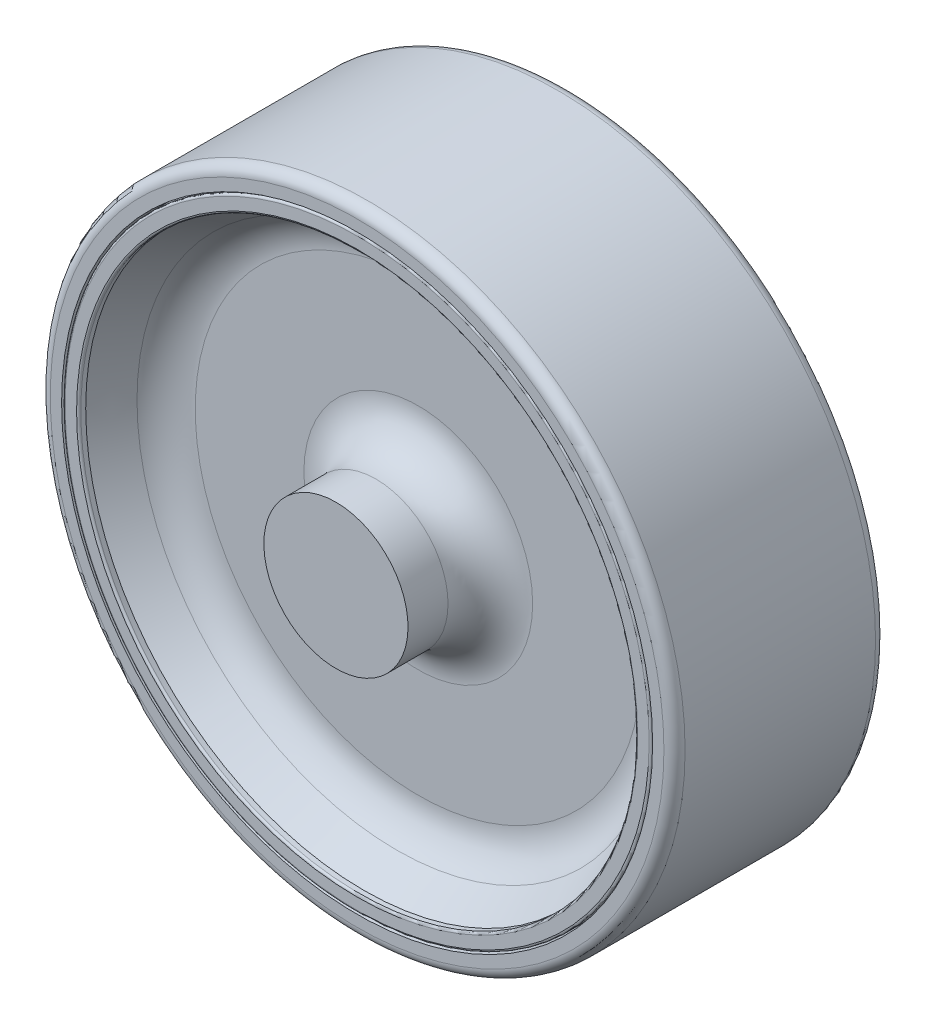
ISO-10303-21;
HEADER;
FILE_DESCRIPTION(('STEP AP214'),'2;1');
FILE_NAME('part.step','',(''),(''),'','','');
FILE_SCHEMA(('AUTOMOTIVE_DESIGN { 1 0 10303 214 1 1 1 1 }'));
ENDSEC;
DATA;
#1=APPLICATION_CONTEXT('core data for automotive mechanical design processes');
#2=APPLICATION_PROTOCOL_DEFINITION('international standard','automotive_design',2000,#1);
#3=PRODUCT_CONTEXT('',#1,'mechanical');
#4=PRODUCT('Part','Part','',(#3));
#5=PRODUCT_RELATED_PRODUCT_CATEGORY('part','',(#4));
#6=PRODUCT_DEFINITION_FORMATION('','',#4);
#7=PRODUCT_DEFINITION_CONTEXT('part definition',#1,'design');
#8=PRODUCT_DEFINITION('design','',#6,#7);
#9=PRODUCT_DEFINITION_SHAPE('','',#8);
#10=(LENGTH_UNIT() NAMED_UNIT(*) SI_UNIT(.MILLI.,.METRE.));
#11=(NAMED_UNIT(*) PLANE_ANGLE_UNIT() SI_UNIT($,.RADIAN.));
#12=(NAMED_UNIT(*) SI_UNIT($,.STERADIAN.) SOLID_ANGLE_UNIT());
#13=UNCERTAINTY_MEASURE_WITH_UNIT(LENGTH_MEASURE(1.E-05),#10,'distance_accuracy_value','');
#14=(GEOMETRIC_REPRESENTATION_CONTEXT(3) GLOBAL_UNCERTAINTY_ASSIGNED_CONTEXT((#13)) GLOBAL_UNIT_ASSIGNED_CONTEXT((#10,
#11,#12)) REPRESENTATION_CONTEXT('',''));
#15=CARTESIAN_POINT('',(0.,0.,0.));
#16=DIRECTION('',(0.,0.,1.));
#17=DIRECTION('',(1.,0.,0.));
#18=AXIS2_PLACEMENT_3D('',#15,#16,#17);
#19=CARTESIAN_POINT('',(0.,0.,0.));
#20=DIRECTION('',(0.,0.,1.));
#21=DIRECTION('',(1.,0.,0.));
#22=AXIS2_PLACEMENT_3D('',#19,#20,#21);
#23=PLANE('',#22);
#24=CARTESIAN_POINT('',(0.,0.,0.));
#25=DIRECTION('',(0.,0.,1.));
#26=DIRECTION('',(1.,0.,0.));
#27=AXIS2_PLACEMENT_3D('',#24,#25,#26);
#28=CIRCLE('',#27,138.005574042216);
#29=CARTESIAN_POINT('',(138.005574042216,0.,0.));
#30=VERTEX_POINT('',#29);
#31=EDGE_CURVE('E63',#30,#30,#28,.F.);
#32=ORIENTED_EDGE('',*,*,#31,.T.);
#33=EDGE_LOOP('',(#32));
#34=FACE_BOUND('',#33,.T.);
#35=CARTESIAN_POINT('',(0.,0.,0.));
#36=DIRECTION('',(0.,0.,1.));
#37=DIRECTION('',(1.,0.,0.));
#38=AXIS2_PLACEMENT_3D('',#35,#36,#37);
#39=CIRCLE('',#38,132.569110555844);
#40=CARTESIAN_POINT('',(132.569110555844,0.,0.));
#41=VERTEX_POINT('',#40);
#42=EDGE_CURVE('E67',#41,#41,#39,.T.);
#43=ORIENTED_EDGE('',*,*,#42,.T.);
#44=EDGE_LOOP('',(#43));
#45=FACE_BOUND('',#44,.T.);
#46=ADVANCED_FACE('F56',(#34,#45),#23,.F.);
#47=CARTESIAN_POINT('',(0.,117.046370363083,55.1866929259859));
#48=DIRECTION('',(0.,0.,1.));
#49=DIRECTION('',(1.,0.,0.));
#50=AXIS2_PLACEMENT_3D('',#47,#48,#49);
#51=PLANE('',#50);
#52=CARTESIAN_POINT('',(0.,0.,55.1866929259859));
#53=DIRECTION('',(0.,0.,1.));
#54=DIRECTION('',(1.,0.,0.));
#55=AXIS2_PLACEMENT_3D('',#52,#53,#54);
#56=CIRCLE('',#55,102.105376154167);
#57=CARTESIAN_POINT('',(102.105376154167,0.,55.1866929259859));
#58=VERTEX_POINT('',#57);
#59=EDGE_CURVE('E108',#58,#58,#56,.F.);
#60=ORIENTED_EDGE('',*,*,#59,.T.);
#61=EDGE_LOOP('',(#60));
#62=FACE_BOUND('',#61,.T.);
#63=CARTESIAN_POINT('',(0.,0.,55.1866929259859));
#64=DIRECTION('',(0.,0.,1.));
#65=DIRECTION('',(1.,0.,0.));
#66=AXIS2_PLACEMENT_3D('',#63,#64,#65);
#67=CIRCLE('',#66,51.7094515153373);
#68=CARTESIAN_POINT('',(51.7094515153373,0.,55.1866929259859));
#69=VERTEX_POINT('',#68);
#70=EDGE_CURVE('E105',#69,#69,#67,.T.);
#71=ORIENTED_EDGE('',*,*,#70,.T.);
#72=EDGE_LOOP('',(#71));
#73=FACE_BOUND('',#72,.T.);
#74=ADVANCED_FACE('F148',(#62,#73),#51,.F.);
#75=CARTESIAN_POINT('',(0.,0.,6.08599989331893));
#76=DIRECTION('',(0.,0.,-1.));
#77=DIRECTION('',(-1.,0.,0.));
#78=AXIS2_PLACEMENT_3D('',#75,#76,#77);
#79=CONICAL_SURFACE('',#78,131.569110555844,0.287575830780447);
#80=CARTESIAN_POINT('',(0.,0.,40.8592617631792));
#81=DIRECTION('',(0.,0.,-1.));
#82=DIRECTION('',(-1.,0.,0.));
#83=AXIS2_PLACEMENT_3D('',#80,#81,#82);
#84=CIRCLE('',#83,121.284061270392);
#85=CARTESIAN_POINT('',(-121.284061270392,0.,40.8592617631792));
#86=VERTEX_POINT('',#85);
#87=EDGE_CURVE('E101',#86,#86,#84,.F.);
#88=ORIENTED_EDGE('',*,*,#87,.T.);
#89=EDGE_LOOP('',(#88));
#90=FACE_BOUND('',#89,.T.);
#91=CARTESIAN_POINT('',(0.,0.,6.08599989331893));
#92=DIRECTION('',(0.,0.,-1.));
#93=DIRECTION('',(-1.,0.,0.));
#94=AXIS2_PLACEMENT_3D('',#91,#92,#93);
#95=CIRCLE('',#94,131.569110555844);
#96=CARTESIAN_POINT('',(-131.569110555844,0.,6.08599989331893));
#97=VERTEX_POINT('',#96);
#98=EDGE_CURVE('E98',#97,#97,#95,.T.);
#99=ORIENTED_EDGE('',*,*,#98,.T.);
#100=EDGE_LOOP('',(#99));
#101=FACE_BOUND('',#100,.T.);
#102=ADVANCED_FACE('F153',(#90,#101),#79,.F.);
#103=CARTESIAN_POINT('',(0.,0.,0.));
#104=DIRECTION('',(0.,0.,-1.));
#105=DIRECTION('',(-1.,0.,0.));
#106=AXIS2_PLACEMENT_3D('',#103,#104,#105);
#107=CYLINDRICAL_SURFACE('',#106,131.569110555844);
#108=CARTESIAN_POINT('',(0.,0.,1.));
#109=DIRECTION('',(0.,0.,1.));
#110=DIRECTION('',(1.,0.,0.));
#111=AXIS2_PLACEMENT_3D('',#108,#109,#110);
#112=CIRCLE('',#111,131.569110555844);
#113=CARTESIAN_POINT('',(131.569110555844,0.,1.));
#114=VERTEX_POINT('',#113);
#115=EDGE_CURVE('E13',#114,#114,#112,.F.);
#116=ORIENTED_EDGE('',*,*,#115,.T.);
#117=EDGE_LOOP('',(#116));
#118=FACE_BOUND('',#117,.T.);
#119=ORIENTED_EDGE('',*,*,#98,.F.);
#120=EDGE_LOOP('',(#119));
#121=FACE_BOUND('',#120,.T.);
#122=ADVANCED_FACE('F210',(#118,#121),#107,.F.);
#123=CARTESIAN_POINT('',(0.,0.,55.1866929259859));
#124=DIRECTION('',(0.,0.,1.));
#125=DIRECTION('',(1.,0.,0.));
#126=AXIS2_PLACEMENT_3D('',#123,#124,#125);
#127=CONICAL_SURFACE('',#126,34.0592835473077,0.124662819706969);
#128=CARTESIAN_POINT('',(0.,0.,37.6734964620703));
#129=DIRECTION('',(0.,0.,1.));
#130=DIRECTION('',(1.,0.,0.));
#131=AXIS2_PLACEMENT_3D('',#128,#129,#130);
#132=CIRCLE('',#131,31.8646585415388);
#133=CARTESIAN_POINT('',(31.8646585415388,0.,37.6734964620703));
#134=VERTEX_POINT('',#133);
#135=EDGE_CURVE('E93',#134,#134,#132,.F.);
#136=ORIENTED_EDGE('',*,*,#135,.T.);
#137=EDGE_LOOP('',(#136));
#138=FACE_BOUND('',#137,.T.);
#139=CARTESIAN_POINT('',(0.,0.,-5.));
#140=DIRECTION('',(0.,0.,-1.));
#141=DIRECTION('',(0.,1.,0.));
#142=AXIS2_PLACEMENT_3D('',#139,#140,#141);
#143=CIRCLE('',#142,26.517129744485);
#144=CARTESIAN_POINT('',(0.,26.5171297444851,-5.));
#145=VERTEX_POINT('',#144);
#146=EDGE_CURVE('E89',#145,#145,#143,.T.);
#147=ORIENTED_EDGE('',*,*,#146,.F.);
#148=EDGE_LOOP('',(#147));
#149=FACE_BOUND('',#148,.T.);
#150=ADVANCED_FACE('F214',(#138,#149),#127,.T.);
#151=CARTESIAN_POINT('',(0.,0.,35.1866929259859));
#152=DIRECTION('',(0.,0.,1.));
#153=DIRECTION('',(1.,0.,0.));
#154=AXIS2_PLACEMENT_3D('',#151,#152,#153);
#155=TOROIDAL_SURFACE('',#154,102.105376154167,20.);
#156=ORIENTED_EDGE('',*,*,#87,.F.);
#157=EDGE_LOOP('',(#156));
#158=FACE_BOUND('',#157,.T.);
#159=ORIENTED_EDGE('',*,*,#59,.F.);
#160=EDGE_LOOP('',(#159));
#161=FACE_BOUND('',#160,.T.);
#162=ADVANCED_FACE('F204',(#158,#161),#155,.F.);
#163=CARTESIAN_POINT('',(0.,0.,35.1866929259859));
#164=DIRECTION('',(0.,0.,1.));
#165=DIRECTION('',(1.,0.,0.));
#166=AXIS2_PLACEMENT_3D('',#163,#164,#165);
#167=TOROIDAL_SURFACE('',#166,51.7094515153373,20.);
#168=ORIENTED_EDGE('',*,*,#70,.F.);
#169=EDGE_LOOP('',(#168));
#170=FACE_BOUND('',#169,.T.);
#171=ORIENTED_EDGE('',*,*,#135,.F.);
#172=EDGE_LOOP('',(#171));
#173=FACE_BOUND('',#172,.T.);
#174=ADVANCED_FACE('F199',(#170,#173),#167,.F.);
#175=CARTESIAN_POINT('',(0.,0.,-5.));
#176=DIRECTION('',(0.,0.,-1.));
#177=DIRECTION('',(0.,1.,0.));
#178=AXIS2_PLACEMENT_3D('',#175,#176,#177);
#179=PLANE('',#178);
#180=ORIENTED_EDGE('',*,*,#146,.T.);
#181=EDGE_LOOP('',(#180));
#182=FACE_BOUND('',#181,.T.);
#183=ADVANCED_FACE('F186',(#182),#179,.T.);
#184=CARTESIAN_POINT('',(0.,0.,118.));
#185=DIRECTION('',(0.,0.,-1.));
#186=DIRECTION('',(0.,1.,0.));
#187=AXIS2_PLACEMENT_3D('',#184,#185,#186);
#188=CYLINDRICAL_SURFACE('',#187,139.005574042216);
#189=CARTESIAN_POINT('',(0.,0.,1.));
#190=DIRECTION('',(0.,0.,1.));
#191=DIRECTION('',(1.,0.,0.));
#192=AXIS2_PLACEMENT_3D('',#189,#190,#191);
#193=CIRCLE('',#192,139.005574042216);
#194=CARTESIAN_POINT('',(139.005574042216,0.,1.));
#195=VERTEX_POINT('',#194);
#196=EDGE_CURVE('E71',#195,#195,#193,.T.);
#197=ORIENTED_EDGE('',*,*,#196,.T.);
#198=EDGE_LOOP('',(#197));
#199=FACE_BOUND('',#198,.T.);
#200=CARTESIAN_POINT('',(0.,0.,99.));
#201=DIRECTION('',(0.,0.,1.));
#202=DIRECTION('',(1.,0.,0.));
#203=AXIS2_PLACEMENT_3D('',#200,#201,#202);
#204=CIRCLE('',#203,139.005574042216);
#205=CARTESIAN_POINT('',(139.005574042216,0.,99.));
#206=VERTEX_POINT('',#205);
#207=EDGE_CURVE('E79',#206,#206,#204,.F.);
#208=ORIENTED_EDGE('',*,*,#207,.T.);
#209=EDGE_LOOP('',(#208));
#210=FACE_BOUND('',#209,.T.);
#211=ADVANCED_FACE('F159',(#199,#210),#188,.T.);
#212=CARTESIAN_POINT('',(0.,0.,110.));
#213=DIRECTION('',(0.,0.,1.));
#214=DIRECTION('',(0.,-1.,0.));
#215=AXIS2_PLACEMENT_3D('',#212,#213,#214);
#216=PLANE('',#215);
#217=CARTESIAN_POINT('',(0.,0.,110.));
#218=DIRECTION('',(0.,0.,-1.));
#219=DIRECTION('',(0.,1.,0.));
#220=AXIS2_PLACEMENT_3D('',#217,#218,#219);
#221=CIRCLE('',#220,34.0592835473077);
#222=CARTESIAN_POINT('',(0.,34.0592835473077,110.));
#223=VERTEX_POINT('',#222);
#224=EDGE_CURVE('E94',#223,#223,#221,.T.);
#225=ORIENTED_EDGE('',*,*,#224,.F.);
#226=EDGE_LOOP('',(#225));
#227=FACE_BOUND('',#226,.T.);
#228=ADVANCED_FACE('F185',(#227),#216,.T.);
#229=CARTESIAN_POINT('',(0.,0.,0.));
#230=DIRECTION('',(0.,0.,-1.));
#231=DIRECTION('',(-1.,0.,0.));
#232=AXIS2_PLACEMENT_3D('',#229,#230,#231);
#233=CYLINDRICAL_SURFACE('',#232,34.0592835473077);
#234=CARTESIAN_POINT('',(0.,0.,91.0925512323429));
#235=DIRECTION('',(0.,0.,1.));
#236=DIRECTION('',(1.,0.,0.));
#237=AXIS2_PLACEMENT_3D('',#234,#235,#236);
#238=CIRCLE('',#237,34.0592835473077);
#239=CARTESIAN_POINT('',(34.0592835473077,0.,91.0925512323429));
#240=VERTEX_POINT('',#239);
#241=EDGE_CURVE('E92',#240,#240,#238,.T.);
#242=ORIENTED_EDGE('',*,*,#241,.T.);
#243=EDGE_LOOP('',(#242));
#244=FACE_BOUND('',#243,.T.);
#245=ORIENTED_EDGE('',*,*,#224,.T.);
#246=EDGE_LOOP('',(#245));
#247=FACE_BOUND('',#246,.T.);
#248=ADVANCED_FACE('F125',(#244,#247),#233,.T.);
#249=CARTESIAN_POINT('',(0.,0.,91.0925512323429));
#250=DIRECTION('',(0.,0.,1.));
#251=DIRECTION('',(1.,0.,0.));
#252=AXIS2_PLACEMENT_3D('',#249,#250,#251);
#253=TOROIDAL_SURFACE('',#252,54.0592835473078,20.);
#254=ORIENTED_EDGE('',*,*,#241,.F.);
#255=EDGE_LOOP('',(#254));
#256=FACE_BOUND('',#255,.T.);
#257=CARTESIAN_POINT('',(0.,0.,71.0925512323429));
#258=DIRECTION('',(0.,0.,1.));
#259=DIRECTION('',(1.,0.,0.));
#260=AXIS2_PLACEMENT_3D('',#257,#258,#259);
#261=CIRCLE('',#260,54.0592835473078);
#262=CARTESIAN_POINT('',(54.0592835473078,0.,71.0925512323429));
#263=VERTEX_POINT('',#262);
#264=EDGE_CURVE('E117',#263,#263,#261,.F.);
#265=ORIENTED_EDGE('',*,*,#264,.F.);
#266=EDGE_LOOP('',(#265));
#267=FACE_BOUND('',#266,.T.);
#268=ADVANCED_FACE('F128',(#256,#267),#253,.F.);
#269=CARTESIAN_POINT('',(0.,117.046370363083,71.0925512323429));
#270=DIRECTION('',(0.,0.,1.));
#271=DIRECTION('',(1.,0.,0.));
#272=AXIS2_PLACEMENT_3D('',#269,#270,#271);
#273=PLANE('',#272);
#274=CARTESIAN_POINT('',(0.,0.,71.0925512323429));
#275=DIRECTION('',(0.,0.,1.));
#276=DIRECTION('',(1.,0.,0.));
#277=AXIS2_PLACEMENT_3D('',#274,#275,#276);
#278=CIRCLE('',#277,105.400913729372);
#279=CARTESIAN_POINT('',(105.400913729372,0.,71.0925512323429));
#280=VERTEX_POINT('',#279);
#281=EDGE_CURVE('E97',#280,#280,#278,.T.);
#282=ORIENTED_EDGE('',*,*,#281,.T.);
#283=EDGE_LOOP('',(#282));
#284=FACE_BOUND('',#283,.T.);
#285=ORIENTED_EDGE('',*,*,#264,.T.);
#286=EDGE_LOOP('',(#285));
#287=FACE_BOUND('',#286,.T.);
#288=ADVANCED_FACE('F131',(#284,#287),#273,.T.);
#289=CARTESIAN_POINT('',(0.,0.,91.0925512323429));
#290=DIRECTION('',(0.,0.,1.));
#291=DIRECTION('',(1.,0.,0.));
#292=AXIS2_PLACEMENT_3D('',#289,#290,#291);
#293=TOROIDAL_SURFACE('',#292,105.400913729372,20.);
#294=ORIENTED_EDGE('',*,*,#281,.F.);
#295=EDGE_LOOP('',(#294));
#296=FACE_BOUND('',#295,.T.);
#297=CARTESIAN_POINT('',(0.,0.,81.2204408431752));
#298=DIRECTION('',(0.,0.,1.));
#299=DIRECTION('',(1.,0.,0.));
#300=AXIS2_PLACEMENT_3D('',#297,#298,#299);
#301=CIRCLE('',#300,122.794632034096);
#302=CARTESIAN_POINT('',(122.794632034096,0.,81.2204408431752));
#303=VERTEX_POINT('',#302);
#304=EDGE_CURVE('E104',#303,#303,#301,.F.);
#305=ORIENTED_EDGE('',*,*,#304,.F.);
#306=EDGE_LOOP('',(#305));
#307=FACE_BOUND('',#306,.T.);
#308=ADVANCED_FACE('F136',(#296,#307),#293,.F.);
#309=CARTESIAN_POINT('',(0.,0.,96.6802363338736));
#310=DIRECTION('',(0.,0.,1.));
#311=DIRECTION('',(1.,0.,0.));
#312=AXIS2_PLACEMENT_3D('',#309,#310,#311);
#313=CONICAL_SURFACE('',#312,131.569110555844,0.516230670611747);
#314=ORIENTED_EDGE('',*,*,#304,.T.);
#315=EDGE_LOOP('',(#314));
#316=FACE_BOUND('',#315,.T.);
#317=CARTESIAN_POINT('',(0.,0.,96.6802363338736));
#318=DIRECTION('',(0.,0.,-1.));
#319=DIRECTION('',(-1.,0.,0.));
#320=AXIS2_PLACEMENT_3D('',#317,#318,#319);
#321=CIRCLE('',#320,131.569110555844);
#322=CARTESIAN_POINT('',(-131.569110555844,0.,96.6802363338736));
#323=VERTEX_POINT('',#322);
#324=EDGE_CURVE('E88',#323,#323,#321,.T.);
#325=ORIENTED_EDGE('',*,*,#324,.F.);
#326=EDGE_LOOP('',(#325));
#327=FACE_BOUND('',#326,.T.);
#328=ADVANCED_FACE('F142',(#316,#327),#313,.F.);
#329=CARTESIAN_POINT('',(0.,0.,0.));
#330=DIRECTION('',(0.,0.,-1.));
#331=DIRECTION('',(-1.,0.,0.));
#332=AXIS2_PLACEMENT_3D('',#329,#330,#331);
#333=CYLINDRICAL_SURFACE('',#332,131.569110555844);
#334=CARTESIAN_POINT('',(0.,0.,99.));
#335=DIRECTION('',(0.,0.,1.));
#336=DIRECTION('',(1.,0.,0.));
#337=AXIS2_PLACEMENT_3D('',#334,#335,#336);
#338=CIRCLE('',#337,131.569110555844);
#339=CARTESIAN_POINT('',(131.569110555844,0.,99.));
#340=VERTEX_POINT('',#339);
#341=EDGE_CURVE('E76',#340,#340,#338,.T.);
#342=ORIENTED_EDGE('',*,*,#341,.T.);
#343=EDGE_LOOP('',(#342));
#344=FACE_BOUND('',#343,.T.);
#345=ORIENTED_EDGE('',*,*,#324,.T.);
#346=EDGE_LOOP('',(#345));
#347=FACE_BOUND('',#346,.T.);
#348=ADVANCED_FACE('F165',(#344,#347),#333,.F.);
#349=CARTESIAN_POINT('',(0.,0.,100.));
#350=DIRECTION('',(0.,0.,1.));
#351=DIRECTION('',(1.,0.,0.));
#352=AXIS2_PLACEMENT_3D('',#349,#350,#351);
#353=PLANE('',#352);
#354=CARTESIAN_POINT('',(0.,0.,100.));
#355=DIRECTION('',(0.,0.,1.));
#356=DIRECTION('',(1.,0.,0.));
#357=AXIS2_PLACEMENT_3D('',#354,#355,#356);
#358=CIRCLE('',#357,138.005574042216);
#359=CARTESIAN_POINT('',(138.005574042216,0.,100.));
#360=VERTEX_POINT('',#359);
#361=EDGE_CURVE('E82',#360,#360,#358,.T.);
#362=ORIENTED_EDGE('',*,*,#361,.T.);
#363=EDGE_LOOP('',(#362));
#364=FACE_BOUND('',#363,.T.);
#365=CARTESIAN_POINT('',(0.,0.,100.));
#366=DIRECTION('',(0.,0.,1.));
#367=DIRECTION('',(1.,0.,0.));
#368=AXIS2_PLACEMENT_3D('',#365,#366,#367);
#369=CIRCLE('',#368,132.569110555844);
#370=CARTESIAN_POINT('',(132.569110555844,0.,100.));
#371=VERTEX_POINT('',#370);
#372=EDGE_CURVE('E85',#371,#371,#369,.F.);
#373=ORIENTED_EDGE('',*,*,#372,.T.);
#374=EDGE_LOOP('',(#373));
#375=FACE_BOUND('',#374,.T.);
#376=ADVANCED_FACE('F161',(#364,#375),#353,.T.);
#377=CARTESIAN_POINT('',(0.,0.,99.));
#378=DIRECTION('',(0.,0.,1.));
#379=DIRECTION('',(1.,0.,0.));
#380=AXIS2_PLACEMENT_3D('',#377,#378,#379);
#381=TOROIDAL_SURFACE('',#380,138.005574042216,1.);
#382=ORIENTED_EDGE('',*,*,#207,.F.);
#383=EDGE_LOOP('',(#382));
#384=FACE_BOUND('',#383,.T.);
#385=ORIENTED_EDGE('',*,*,#361,.F.);
#386=EDGE_LOOP('',(#385));
#387=FACE_BOUND('',#386,.T.);
#388=ADVANCED_FACE('F164',(#384,#387),#381,.T.);
#389=CARTESIAN_POINT('',(0.,0.,99.));
#390=DIRECTION('',(0.,0.,1.));
#391=DIRECTION('',(1.,0.,0.));
#392=AXIS2_PLACEMENT_3D('',#389,#390,#391);
#393=TOROIDAL_SURFACE('',#392,132.569110555844,1.);
#394=ORIENTED_EDGE('',*,*,#341,.F.);
#395=EDGE_LOOP('',(#394));
#396=FACE_BOUND('',#395,.T.);
#397=ORIENTED_EDGE('',*,*,#372,.F.);
#398=EDGE_LOOP('',(#397));
#399=FACE_BOUND('',#398,.T.);
#400=ADVANCED_FACE('F169',(#396,#399),#393,.T.);
#401=CARTESIAN_POINT('',(0.,0.,1.));
#402=DIRECTION('',(0.,0.,1.));
#403=DIRECTION('',(1.,0.,0.));
#404=AXIS2_PLACEMENT_3D('',#401,#402,#403);
#405=TOROIDAL_SURFACE('',#404,138.005574042216,1.);
#406=ORIENTED_EDGE('',*,*,#31,.F.);
#407=EDGE_LOOP('',(#406));
#408=FACE_BOUND('',#407,.T.);
#409=ORIENTED_EDGE('',*,*,#196,.F.);
#410=EDGE_LOOP('',(#409));
#411=FACE_BOUND('',#410,.T.);
#412=ADVANCED_FACE('F172',(#408,#411),#405,.T.);
#413=CARTESIAN_POINT('',(0.,0.,1.));
#414=DIRECTION('',(0.,0.,1.));
#415=DIRECTION('',(1.,0.,0.));
#416=AXIS2_PLACEMENT_3D('',#413,#414,#415);
#417=TOROIDAL_SURFACE('',#416,132.569110555844,1.);
#418=ORIENTED_EDGE('',*,*,#42,.F.);
#419=EDGE_LOOP('',(#418));
#420=FACE_BOUND('',#419,.T.);
#421=ORIENTED_EDGE('',*,*,#115,.F.);
#422=EDGE_LOOP('',(#421));
#423=FACE_BOUND('',#422,.T.);
#424=ADVANCED_FACE('F58',(#420,#423),#417,.T.);
#425=CLOSED_SHELL('',(#46,#74,#102,#122,#150,#162,#174,#183,#211,#228,#248,#268,#288,#308,#328,
#348,#376,#388,#400,#412,#424));
#426=MANIFOLD_SOLID_BREP('B2',#425);
#427=CARTESIAN_POINT('',(0.,0.,5.));
#428=DIRECTION('',(0.,0.,1.));
#429=DIRECTION('',(1.,0.,0.));
#430=AXIS2_PLACEMENT_3D('',#427,#428,#429);
#431=TOROIDAL_SURFACE('',#430,145.,5.);
#432=CARTESIAN_POINT('',(0.,0.,0.));
#433=DIRECTION('',(0.,0.,1.));
#434=DIRECTION('',(1.,0.,0.));
#435=AXIS2_PLACEMENT_3D('',#432,#433,#434);
#436=CIRCLE('',#435,145.);
#437=CARTESIAN_POINT('',(145.,0.,0.));
#438=VERTEX_POINT('',#437);
#439=EDGE_CURVE('E395',#438,#438,#436,.F.);
#440=ORIENTED_EDGE('',*,*,#439,.F.);
#441=EDGE_LOOP('',(#440));
#442=FACE_BOUND('',#441,.T.);
#443=CARTESIAN_POINT('',(0.,0.,5.));
#444=DIRECTION('',(0.,0.,1.));
#445=DIRECTION('',(1.,0.,0.));
#446=AXIS2_PLACEMENT_3D('',#443,#444,#445);
#447=CIRCLE('',#446,150.);
#448=CARTESIAN_POINT('',(150.,0.,5.));
#449=VERTEX_POINT('',#448);
#450=EDGE_CURVE('E404',#449,#449,#447,.T.);
#451=ORIENTED_EDGE('',*,*,#450,.F.);
#452=EDGE_LOOP('',(#451));
#453=FACE_BOUND('',#452,.T.);
#454=ADVANCED_FACE('F384',(#442,#453),#431,.T.);
#455=CARTESIAN_POINT('',(0.,0.,0.));
#456=DIRECTION('',(0.,0.,1.));
#457=DIRECTION('',(1.,0.,0.));
#458=AXIS2_PLACEMENT_3D('',#455,#456,#457);
#459=PLANE('',#458);
#460=CARTESIAN_POINT('',(0.,0.,0.));
#461=DIRECTION('',(0.,0.,1.));
#462=DIRECTION('',(1.,0.,0.));
#463=AXIS2_PLACEMENT_3D('',#460,#461,#462);
#464=CIRCLE('',#463,140.644957961162);
#465=CARTESIAN_POINT('',(140.644957961162,0.,0.));
#466=VERTEX_POINT('',#465);
#467=EDGE_CURVE('E391',#466,#466,#464,.T.);
#468=ORIENTED_EDGE('',*,*,#467,.T.);
#469=EDGE_LOOP('',(#468));
#470=FACE_BOUND('',#469,.T.);
#471=ORIENTED_EDGE('',*,*,#439,.T.);
#472=EDGE_LOOP('',(#471));
#473=FACE_BOUND('',#472,.T.);
#474=ADVANCED_FACE('F434',(#470,#473),#459,.F.);
#475=CARTESIAN_POINT('',(0.,0.,100.));
#476=DIRECTION('',(0.,0.,-1.));
#477=DIRECTION('',(-1.,0.,0.));
#478=AXIS2_PLACEMENT_3D('',#475,#476,#477);
#479=CYLINDRICAL_SURFACE('',#478,150.);
#480=CARTESIAN_POINT('',(0.,0.,95.));
#481=DIRECTION('',(0.,0.,1.));
#482=DIRECTION('',(1.,0.,0.));
#483=AXIS2_PLACEMENT_3D('',#480,#481,#482);
#484=CIRCLE('',#483,150.);
#485=CARTESIAN_POINT('',(150.,0.,95.));
#486=VERTEX_POINT('',#485);
#487=EDGE_CURVE('E399',#486,#486,#484,.F.);
#488=ORIENTED_EDGE('',*,*,#487,.T.);
#489=EDGE_LOOP('',(#488));
#490=FACE_BOUND('',#489,.T.);
#491=ORIENTED_EDGE('',*,*,#450,.T.);
#492=EDGE_LOOP('',(#491));
#493=FACE_BOUND('',#492,.T.);
#494=ADVANCED_FACE('F429',(#490,#493),#479,.T.);
#495=CARTESIAN_POINT('',(0.,0.,95.));
#496=DIRECTION('',(0.,0.,1.));
#497=DIRECTION('',(1.,0.,0.));
#498=AXIS2_PLACEMENT_3D('',#495,#496,#497);
#499=TOROIDAL_SURFACE('',#498,145.,5.);
#500=ORIENTED_EDGE('',*,*,#487,.F.);
#501=EDGE_LOOP('',(#500));
#502=FACE_BOUND('',#501,.T.);
#503=CARTESIAN_POINT('',(0.,0.,100.));
#504=DIRECTION('',(0.,0.,1.));
#505=DIRECTION('',(1.,0.,0.));
#506=AXIS2_PLACEMENT_3D('',#503,#504,#505);
#507=CIRCLE('',#506,145.);
#508=CARTESIAN_POINT('',(145.,0.,100.));
#509=VERTEX_POINT('',#508);
#510=EDGE_CURVE('E407',#509,#509,#507,.T.);
#511=ORIENTED_EDGE('',*,*,#510,.F.);
#512=EDGE_LOOP('',(#511));
#513=FACE_BOUND('',#512,.T.);
#514=ADVANCED_FACE('F421',(#502,#513),#499,.T.);
#515=CARTESIAN_POINT('',(0.,0.,100.));
#516=DIRECTION('',(0.,0.,1.));
#517=DIRECTION('',(1.,0.,0.));
#518=AXIS2_PLACEMENT_3D('',#515,#516,#517);
#519=PLANE('',#518);
#520=ORIENTED_EDGE('',*,*,#510,.T.);
#521=EDGE_LOOP('',(#520));
#522=FACE_BOUND('',#521,.T.);
#523=CARTESIAN_POINT('',(0.,0.,100.));
#524=DIRECTION('',(0.,0.,1.));
#525=DIRECTION('',(1.,0.,0.));
#526=AXIS2_PLACEMENT_3D('',#523,#524,#525);
#527=CIRCLE('',#526,139.644957961162);
#528=CARTESIAN_POINT('',(139.644957961162,0.,100.));
#529=VERTEX_POINT('',#528);
#530=EDGE_CURVE('E410',#529,#529,#527,.T.);
#531=ORIENTED_EDGE('',*,*,#530,.F.);
#532=EDGE_LOOP('',(#531));
#533=FACE_BOUND('',#532,.T.);
#534=ADVANCED_FACE('F419',(#522,#533),#519,.T.);
#535=CARTESIAN_POINT('',(0.,0.,118.));
#536=DIRECTION('',(0.,0.,-1.));
#537=DIRECTION('',(0.,1.,0.));
#538=AXIS2_PLACEMENT_3D('',#535,#536,#537);
#539=CYLINDRICAL_SURFACE('',#538,139.644957961162);
#540=CARTESIAN_POINT('',(0.,0.,1.));
#541=DIRECTION('',(0.,0.,1.));
#542=DIRECTION('',(1.,0.,0.));
#543=AXIS2_PLACEMENT_3D('',#540,#541,#542);
#544=CIRCLE('',#543,139.644957961162);
#545=CARTESIAN_POINT('',(139.644957961162,0.,1.));
#546=VERTEX_POINT('',#545);
#547=EDGE_CURVE('E55',#546,#546,#544,.F.);
#548=ORIENTED_EDGE('',*,*,#547,.T.);
#549=EDGE_LOOP('',(#548));
#550=FACE_BOUND('',#549,.T.);
#551=ORIENTED_EDGE('',*,*,#530,.T.);
#552=EDGE_LOOP('',(#551));
#553=FACE_BOUND('',#552,.T.);
#554=ADVANCED_FACE('F417',(#550,#553),#539,.F.);
#555=CARTESIAN_POINT('',(0.,0.,1.));
#556=DIRECTION('',(0.,0.,1.));
#557=DIRECTION('',(1.,0.,0.));
#558=AXIS2_PLACEMENT_3D('',#555,#556,#557);
#559=TOROIDAL_SURFACE('',#558,140.644957961162,1.);
#560=ORIENTED_EDGE('',*,*,#547,.F.);
#561=EDGE_LOOP('',(#560));
#562=FACE_BOUND('',#561,.T.);
#563=ORIENTED_EDGE('',*,*,#467,.F.);
#564=EDGE_LOOP('',(#563));
#565=FACE_BOUND('',#564,.T.);
#566=ADVANCED_FACE('F386',(#562,#565),#559,.T.);
#567=CLOSED_SHELL('',(#454,#474,#494,#514,#534,#554,#566));
#568=MANIFOLD_SOLID_BREP('B8',#567);
#569=ADVANCED_BREP_SHAPE_REPRESENTATION('',(#18,#426,#568),#14);
#570=SHAPE_DEFINITION_REPRESENTATION(#9,#569);
ENDSEC;
END-ISO-10303-21;
